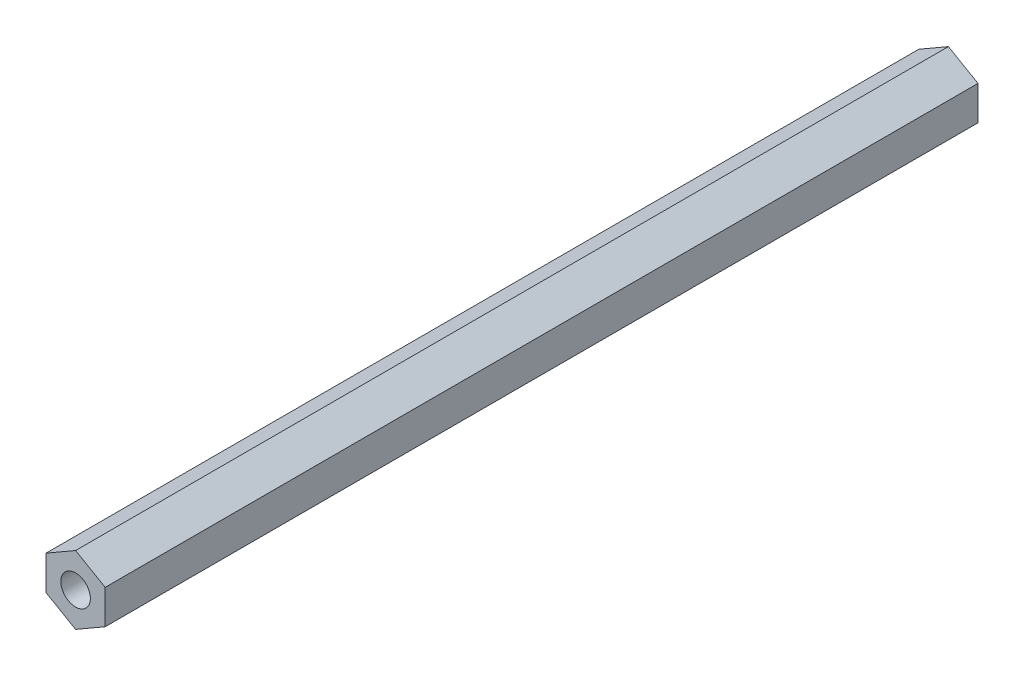
ISO-10303-21;
HEADER;
FILE_DESCRIPTION(('STEP AP214'),'2;1');
FILE_NAME('part.step','',(''),(''),'','','');
FILE_SCHEMA(('AUTOMOTIVE_DESIGN { 1 0 10303 214 1 1 1 1 }'));
ENDSEC;
DATA;
#1=APPLICATION_CONTEXT('core data for automotive mechanical design processes');
#2=APPLICATION_PROTOCOL_DEFINITION('international standard','automotive_design',2000,#1);
#3=PRODUCT_CONTEXT('',#1,'mechanical');
#4=PRODUCT('Part','Part','',(#3));
#5=PRODUCT_RELATED_PRODUCT_CATEGORY('part','',(#4));
#6=PRODUCT_DEFINITION_FORMATION('','',#4);
#7=PRODUCT_DEFINITION_CONTEXT('part definition',#1,'design');
#8=PRODUCT_DEFINITION('design','',#6,#7);
#9=PRODUCT_DEFINITION_SHAPE('','',#8);
#10=(LENGTH_UNIT() NAMED_UNIT(*) SI_UNIT(.MILLI.,.METRE.));
#11=(NAMED_UNIT(*) PLANE_ANGLE_UNIT() SI_UNIT($,.RADIAN.));
#12=(NAMED_UNIT(*) SI_UNIT($,.STERADIAN.) SOLID_ANGLE_UNIT());
#13=UNCERTAINTY_MEASURE_WITH_UNIT(LENGTH_MEASURE(1.E-05),#10,'distance_accuracy_value','');
#14=(GEOMETRIC_REPRESENTATION_CONTEXT(3) GLOBAL_UNCERTAINTY_ASSIGNED_CONTEXT((#13)) GLOBAL_UNIT_ASSIGNED_CONTEXT((#10,
#11,#12)) REPRESENTATION_CONTEXT('',''));
#15=CARTESIAN_POINT('',(0.,0.,0.));
#16=DIRECTION('',(0.,0.,1.));
#17=DIRECTION('',(1.,0.,0.));
#18=AXIS2_PLACEMENT_3D('',#15,#16,#17);
#19=CARTESIAN_POINT('',(0.,0.,187.325));
#20=DIRECTION('',(0.,0.,1.));
#21=DIRECTION('',(1.,0.,0.));
#22=AXIS2_PLACEMENT_3D('',#19,#20,#21);
#23=PLANE('',#22);
#24=DIRECTION('',(-0.866025403784441,0.499999999999995,0.));
#25=VECTOR('',#24,1.);
#26=CARTESIAN_POINT('',(6.34999999999995,3.66617420935419,187.325));
#27=LINE('',#26,#25);
#28=CARTESIAN_POINT('',(6.34999999999995,3.66617420935419,187.325));
#29=VERTEX_POINT('',#28);
#30=CARTESIAN_POINT('',(0.,7.33234841870824,187.325));
#31=VERTEX_POINT('',#30);
#32=EDGE_CURVE('E152',#29,#31,#27,.T.);
#33=ORIENTED_EDGE('',*,*,#32,.T.);
#34=DIRECTION('',(-0.866025403784438,-0.500000000000001,0.));
#35=VECTOR('',#34,1.);
#36=CARTESIAN_POINT('',(0.,7.33234841870824,187.325));
#37=LINE('',#36,#35);
#38=CARTESIAN_POINT('',(-6.35,3.6661742093541,187.325));
#39=VERTEX_POINT('',#38);
#40=EDGE_CURVE('E100',#31,#39,#37,.T.);
#41=ORIENTED_EDGE('',*,*,#40,.T.);
#42=DIRECTION('',(0.,-1.,0.));
#43=VECTOR('',#42,1.);
#44=CARTESIAN_POINT('',(-6.35,3.6661742093541,187.325));
#45=LINE('',#44,#43);
#46=CARTESIAN_POINT('',(-6.34999999999998,-3.66617420935415,187.325));
#47=VERTEX_POINT('',#46);
#48=EDGE_CURVE('E113',#39,#47,#45,.T.);
#49=ORIENTED_EDGE('',*,*,#48,.T.);
#50=DIRECTION('',(0.866025403784441,-0.499999999999995,0.));
#51=VECTOR('',#50,1.);
#52=CARTESIAN_POINT('',(-6.34999999999998,-3.66617420935415,187.325));
#53=LINE('',#52,#51);
#54=CARTESIAN_POINT('',(0.,-7.33234841870824,187.325));
#55=VERTEX_POINT('',#54);
#56=EDGE_CURVE('E107',#47,#55,#53,.T.);
#57=ORIENTED_EDGE('',*,*,#56,.T.);
#58=DIRECTION('',(0.866025403784435,0.500000000000007,0.));
#59=VECTOR('',#58,1.);
#60=CARTESIAN_POINT('',(0.,-7.33234841870824,187.325));
#61=LINE('',#60,#59);
#62=CARTESIAN_POINT('',(6.35000000000003,-3.66617420935406,187.325));
#63=VERTEX_POINT('',#62);
#64=EDGE_CURVE('E111',#55,#63,#61,.T.);
#65=ORIENTED_EDGE('',*,*,#64,.T.);
#66=DIRECTION('',(0.,1.,0.));
#67=VECTOR('',#66,1.);
#68=CARTESIAN_POINT('',(6.35000000000003,-3.66617420935406,187.325));
#69=LINE('',#68,#67);
#70=EDGE_CURVE('E63',#63,#29,#69,.T.);
#71=ORIENTED_EDGE('',*,*,#70,.T.);
#72=EDGE_LOOP('',(#33,#41,#49,#57,#65,#71));
#73=FACE_BOUND('',#72,.T.);
#74=CARTESIAN_POINT('',(0.,0.,187.325));
#75=DIRECTION('',(0.,0.,1.));
#76=DIRECTION('',(1.,0.,0.));
#77=AXIS2_PLACEMENT_3D('',#74,#75,#76);
#78=CIRCLE('',#77,3.175);
#79=CARTESIAN_POINT('',(-3.175,0.,187.325));
#80=VERTEX_POINT('',#79);
#81=EDGE_CURVE('E140',#80,#80,#78,.T.);
#82=ORIENTED_EDGE('',*,*,#81,.F.);
#83=EDGE_LOOP('',(#82));
#84=FACE_BOUND('',#83,.T.);
#85=ADVANCED_FACE('F45',(#73,#84),#23,.T.);
#86=CARTESIAN_POINT('',(0.,0.,0.));
#87=DIRECTION('',(0.,0.,1.));
#88=DIRECTION('',(1.,0.,0.));
#89=AXIS2_PLACEMENT_3D('',#86,#87,#88);
#90=PLANE('',#89);
#91=DIRECTION('',(-0.866025403784441,0.499999999999995,0.));
#92=VECTOR('',#91,1.);
#93=CARTESIAN_POINT('',(6.34999999999995,3.66617420935419,0.));
#94=LINE('',#93,#92);
#95=CARTESIAN_POINT('',(6.34999999999995,3.66617420935419,0.));
#96=VERTEX_POINT('',#95);
#97=CARTESIAN_POINT('',(0.,7.33234841870824,0.));
#98=VERTEX_POINT('',#97);
#99=EDGE_CURVE('E135',#96,#98,#94,.T.);
#100=ORIENTED_EDGE('',*,*,#99,.F.);
#101=DIRECTION('',(0.,1.,0.));
#102=VECTOR('',#101,1.);
#103=CARTESIAN_POINT('',(6.35000000000003,-3.66617420935406,0.));
#104=LINE('',#103,#102);
#105=CARTESIAN_POINT('',(6.35000000000003,-3.66617420935406,0.));
#106=VERTEX_POINT('',#105);
#107=EDGE_CURVE('E92',#106,#96,#104,.T.);
#108=ORIENTED_EDGE('',*,*,#107,.F.);
#109=DIRECTION('',(0.866025403784435,0.500000000000007,0.));
#110=VECTOR('',#109,1.);
#111=CARTESIAN_POINT('',(0.,-7.33234841870824,0.));
#112=LINE('',#111,#110);
#113=CARTESIAN_POINT('',(0.,-7.33234841870824,0.));
#114=VERTEX_POINT('',#113);
#115=EDGE_CURVE('E86',#114,#106,#112,.T.);
#116=ORIENTED_EDGE('',*,*,#115,.F.);
#117=DIRECTION('',(0.866025403784441,-0.499999999999995,0.));
#118=VECTOR('',#117,1.);
#119=CARTESIAN_POINT('',(-6.34999999999998,-3.66617420935415,0.));
#120=LINE('',#119,#118);
#121=CARTESIAN_POINT('',(-6.34999999999998,-3.66617420935415,0.));
#122=VERTEX_POINT('',#121);
#123=EDGE_CURVE('E122',#122,#114,#120,.T.);
#124=ORIENTED_EDGE('',*,*,#123,.F.);
#125=DIRECTION('',(0.,-1.,0.));
#126=VECTOR('',#125,1.);
#127=CARTESIAN_POINT('',(-6.35,3.6661742093541,0.));
#128=LINE('',#127,#126);
#129=CARTESIAN_POINT('',(-6.35,3.6661742093541,0.));
#130=VERTEX_POINT('',#129);
#131=EDGE_CURVE('E143',#130,#122,#128,.T.);
#132=ORIENTED_EDGE('',*,*,#131,.F.);
#133=DIRECTION('',(-0.866025403784438,-0.500000000000001,0.));
#134=VECTOR('',#133,1.);
#135=CARTESIAN_POINT('',(0.,7.33234841870824,0.));
#136=LINE('',#135,#134);
#137=EDGE_CURVE('E139',#98,#130,#136,.T.);
#138=ORIENTED_EDGE('',*,*,#137,.F.);
#139=EDGE_LOOP('',(#100,#108,#116,#124,#132,#138));
#140=FACE_BOUND('',#139,.T.);
#141=CARTESIAN_POINT('',(0.,0.,0.));
#142=DIRECTION('',(0.,0.,1.));
#143=DIRECTION('',(1.,0.,0.));
#144=AXIS2_PLACEMENT_3D('',#141,#142,#143);
#145=CIRCLE('',#144,3.175);
#146=CARTESIAN_POINT('',(-3.175,0.,0.));
#147=VERTEX_POINT('',#146);
#148=EDGE_CURVE('E249',#147,#147,#145,.T.);
#149=ORIENTED_EDGE('',*,*,#148,.T.);
#150=EDGE_LOOP('',(#149));
#151=FACE_BOUND('',#150,.T.);
#152=ADVANCED_FACE('F165',(#140,#151),#90,.F.);
#153=CARTESIAN_POINT('',(6.34999999999995,3.66617420935419,187.325));
#154=DIRECTION('',(-0.499999999999995,-0.866025403784441,0.));
#155=DIRECTION('',(0.866025403784442,-0.499999999999995,0.));
#156=AXIS2_PLACEMENT_3D('',#153,#154,#155);
#157=PLANE('',#156);
#158=ORIENTED_EDGE('',*,*,#99,.T.);
#159=DIRECTION('',(0.,0.,-1.));
#160=VECTOR('',#159,1.);
#161=CARTESIAN_POINT('',(0.,7.33234841870824,187.325));
#162=LINE('',#161,#160);
#163=EDGE_CURVE('E11',#31,#98,#162,.T.);
#164=ORIENTED_EDGE('',*,*,#163,.F.);
#165=ORIENTED_EDGE('',*,*,#32,.F.);
#166=DIRECTION('',(0.,0.,-1.));
#167=VECTOR('',#166,1.);
#168=CARTESIAN_POINT('',(6.34999999999995,3.66617420935419,187.325));
#169=LINE('',#168,#167);
#170=EDGE_CURVE('E131',#29,#96,#169,.T.);
#171=ORIENTED_EDGE('',*,*,#170,.T.);
#172=EDGE_LOOP('',(#158,#164,#165,#171));
#173=FACE_BOUND('',#172,.T.);
#174=ADVANCED_FACE('F47',(#173),#157,.F.);
#175=CARTESIAN_POINT('',(0.,7.33234841870824,187.325));
#176=DIRECTION('',(0.500000000000001,-0.866025403784438,0.));
#177=DIRECTION('',(0.866025403784438,0.500000000000001,0.));
#178=AXIS2_PLACEMENT_3D('',#175,#176,#177);
#179=PLANE('',#178);
#180=ORIENTED_EDGE('',*,*,#137,.T.);
#181=DIRECTION('',(0.,0.,-1.));
#182=VECTOR('',#181,1.);
#183=CARTESIAN_POINT('',(-6.35,3.6661742093541,187.325));
#184=LINE('',#183,#182);
#185=EDGE_CURVE('E55',#39,#130,#184,.T.);
#186=ORIENTED_EDGE('',*,*,#185,.F.);
#187=ORIENTED_EDGE('',*,*,#40,.F.);
#188=ORIENTED_EDGE('',*,*,#163,.T.);
#189=EDGE_LOOP('',(#180,#186,#187,#188));
#190=FACE_BOUND('',#189,.T.);
#191=ADVANCED_FACE('F190',(#190),#179,.F.);
#192=CARTESIAN_POINT('',(-6.35,3.6661742093541,187.325));
#193=DIRECTION('',(1.,0.,0.));
#194=DIRECTION('',(0.,1.,0.));
#195=AXIS2_PLACEMENT_3D('',#192,#193,#194);
#196=PLANE('',#195);
#197=ORIENTED_EDGE('',*,*,#131,.T.);
#198=DIRECTION('',(0.,0.,-1.));
#199=VECTOR('',#198,1.);
#200=CARTESIAN_POINT('',(-6.34999999999998,-3.66617420935415,187.325));
#201=LINE('',#200,#199);
#202=EDGE_CURVE('E124',#47,#122,#201,.T.);
#203=ORIENTED_EDGE('',*,*,#202,.F.);
#204=ORIENTED_EDGE('',*,*,#48,.F.);
#205=ORIENTED_EDGE('',*,*,#185,.T.);
#206=EDGE_LOOP('',(#197,#203,#204,#205));
#207=FACE_BOUND('',#206,.T.);
#208=ADVANCED_FACE('F162',(#207),#196,.F.);
#209=CARTESIAN_POINT('',(-6.34999999999998,-3.66617420935415,187.325));
#210=DIRECTION('',(0.499999999999995,0.866025403784441,0.));
#211=DIRECTION('',(-0.866025403784442,0.499999999999995,0.));
#212=AXIS2_PLACEMENT_3D('',#209,#210,#211);
#213=PLANE('',#212);
#214=ORIENTED_EDGE('',*,*,#123,.T.);
#215=DIRECTION('',(0.,0.,-1.));
#216=VECTOR('',#215,1.);
#217=CARTESIAN_POINT('',(0.,-7.33234841870824,187.325));
#218=LINE('',#217,#216);
#219=EDGE_CURVE('E119',#55,#114,#218,.T.);
#220=ORIENTED_EDGE('',*,*,#219,.F.);
#221=ORIENTED_EDGE('',*,*,#56,.F.);
#222=ORIENTED_EDGE('',*,*,#202,.T.);
#223=EDGE_LOOP('',(#214,#220,#221,#222));
#224=FACE_BOUND('',#223,.T.);
#225=ADVANCED_FACE('F120',(#224),#213,.F.);
#226=CARTESIAN_POINT('',(0.,-7.33234841870824,187.325));
#227=DIRECTION('',(-0.500000000000007,0.866025403784434,0.));
#228=DIRECTION('',(-0.866025403784435,-0.500000000000007,0.));
#229=AXIS2_PLACEMENT_3D('',#226,#227,#228);
#230=PLANE('',#229);
#231=ORIENTED_EDGE('',*,*,#115,.T.);
#232=DIRECTION('',(0.,0.,-1.));
#233=VECTOR('',#232,1.);
#234=CARTESIAN_POINT('',(6.35000000000003,-3.66617420935406,187.325));
#235=LINE('',#234,#233);
#236=EDGE_CURVE('E125',#63,#106,#235,.T.);
#237=ORIENTED_EDGE('',*,*,#236,.F.);
#238=ORIENTED_EDGE('',*,*,#64,.F.);
#239=ORIENTED_EDGE('',*,*,#219,.T.);
#240=EDGE_LOOP('',(#231,#237,#238,#239));
#241=FACE_BOUND('',#240,.T.);
#242=ADVANCED_FACE('F127',(#241),#230,.F.);
#243=CARTESIAN_POINT('',(6.35000000000003,-3.66617420935406,187.325));
#244=DIRECTION('',(-1.,0.,0.));
#245=DIRECTION('',(0.,-1.,0.));
#246=AXIS2_PLACEMENT_3D('',#243,#244,#245);
#247=PLANE('',#246);
#248=ORIENTED_EDGE('',*,*,#107,.T.);
#249=ORIENTED_EDGE('',*,*,#170,.F.);
#250=ORIENTED_EDGE('',*,*,#70,.F.);
#251=ORIENTED_EDGE('',*,*,#236,.T.);
#252=EDGE_LOOP('',(#248,#249,#250,#251));
#253=FACE_BOUND('',#252,.T.);
#254=ADVANCED_FACE('F170',(#253),#247,.F.);
#255=CARTESIAN_POINT('',(0.,0.,187.325));
#256=DIRECTION('',(0.,0.,-1.));
#257=DIRECTION('',(-1.,0.,0.));
#258=AXIS2_PLACEMENT_3D('',#255,#256,#257);
#259=CYLINDRICAL_SURFACE('',#258,3.175);
#260=CARTESIAN_POINT('',(-3.175,0.,187.325));
#261=CARTESIAN_POINT('',(-3.175,0.,185.373697916667));
#262=CARTESIAN_POINT('',(-3.175,0.,183.422395833333));
#263=CARTESIAN_POINT('',(-3.175,0.,179.519791666667));
#264=CARTESIAN_POINT('',(-3.175,0.,177.568489583333));
#265=CARTESIAN_POINT('',(-3.175,0.,173.665885416667));
#266=CARTESIAN_POINT('',(-3.175,0.,171.714583333333));
#267=CARTESIAN_POINT('',(-3.175,0.,167.811979166667));
#268=CARTESIAN_POINT('',(-3.175,0.,165.860677083333));
#269=CARTESIAN_POINT('',(-3.175,0.,161.958072916667));
#270=CARTESIAN_POINT('',(-3.175,0.,160.006770833333));
#271=CARTESIAN_POINT('',(-3.175,0.,156.104166666667));
#272=CARTESIAN_POINT('',(-3.175,0.,154.152864583333));
#273=CARTESIAN_POINT('',(-3.175,0.,150.250260416667));
#274=CARTESIAN_POINT('',(-3.175,0.,148.298958333333));
#275=CARTESIAN_POINT('',(-3.175,0.,144.396354166667));
#276=CARTESIAN_POINT('',(-3.175,0.,142.445052083333));
#277=CARTESIAN_POINT('',(-3.175,0.,138.542447916667));
#278=CARTESIAN_POINT('',(-3.175,0.,136.591145833333));
#279=CARTESIAN_POINT('',(-3.175,0.,132.688541666667));
#280=CARTESIAN_POINT('',(-3.175,0.,130.737239583333));
#281=CARTESIAN_POINT('',(-3.175,0.,126.834635416667));
#282=CARTESIAN_POINT('',(-3.175,0.,124.883333333333));
#283=CARTESIAN_POINT('',(-3.175,0.,120.980729166667));
#284=CARTESIAN_POINT('',(-3.175,0.,119.029427083333));
#285=CARTESIAN_POINT('',(-3.175,0.,115.126822916667));
#286=CARTESIAN_POINT('',(-3.175,0.,113.175520833333));
#287=CARTESIAN_POINT('',(-3.175,0.,109.272916666667));
#288=CARTESIAN_POINT('',(-3.175,0.,107.321614583333));
#289=CARTESIAN_POINT('',(-3.175,0.,103.419010416667));
#290=CARTESIAN_POINT('',(-3.175,0.,101.467708333333));
#291=CARTESIAN_POINT('',(-3.175,0.,97.5651041666667));
#292=CARTESIAN_POINT('',(-3.175,0.,95.6138020833333));
#293=CARTESIAN_POINT('',(-3.175,0.,91.7111979166667));
#294=CARTESIAN_POINT('',(-3.175,0.,89.7598958333333));
#295=CARTESIAN_POINT('',(-3.175,0.,85.8572916666667));
#296=CARTESIAN_POINT('',(-3.175,0.,83.9059895833333));
#297=CARTESIAN_POINT('',(-3.175,0.,80.0033854166667));
#298=CARTESIAN_POINT('',(-3.175,0.,78.0520833333333));
#299=CARTESIAN_POINT('',(-3.175,0.,74.1494791666667));
#300=CARTESIAN_POINT('',(-3.175,0.,72.1981770833333));
#301=CARTESIAN_POINT('',(-3.175,0.,68.2955729166667));
#302=CARTESIAN_POINT('',(-3.175,0.,66.3442708333333));
#303=CARTESIAN_POINT('',(-3.175,0.,62.4416666666667));
#304=CARTESIAN_POINT('',(-3.175,0.,60.4903645833333));
#305=CARTESIAN_POINT('',(-3.175,0.,56.5877604166667));
#306=CARTESIAN_POINT('',(-3.175,0.,54.6364583333333));
#307=CARTESIAN_POINT('',(-3.175,0.,50.7338541666667));
#308=CARTESIAN_POINT('',(-3.175,0.,48.7825520833333));
#309=CARTESIAN_POINT('',(-3.175,0.,44.8799479166667));
#310=CARTESIAN_POINT('',(-3.175,0.,42.9286458333333));
#311=CARTESIAN_POINT('',(-3.175,0.,39.0260416666667));
#312=CARTESIAN_POINT('',(-3.175,0.,37.0747395833333));
#313=CARTESIAN_POINT('',(-3.175,0.,33.1721354166667));
#314=CARTESIAN_POINT('',(-3.175,0.,31.2208333333333));
#315=CARTESIAN_POINT('',(-3.175,0.,27.3182291666667));
#316=CARTESIAN_POINT('',(-3.175,0.,25.3669270833333));
#317=CARTESIAN_POINT('',(-3.175,0.,21.4643229166667));
#318=CARTESIAN_POINT('',(-3.175,0.,19.5130208333333));
#319=CARTESIAN_POINT('',(-3.175,0.,15.6104166666667));
#320=CARTESIAN_POINT('',(-3.175,0.,13.6591145833333));
#321=CARTESIAN_POINT('',(-3.175,0.,9.75651041666667));
#322=CARTESIAN_POINT('',(-3.175,0.,7.80520833333334));
#323=CARTESIAN_POINT('',(-3.175,0.,3.90260416666667));
#324=CARTESIAN_POINT('',(-3.175,0.,1.95130208333334));
#325=CARTESIAN_POINT('',(-3.175,0.,0.));
#326=B_SPLINE_CURVE_WITH_KNOTS('',3,(#260,#261,#262,#263,#264,#265,#266,#267,#268,#269,#270,
#271,#272,#273,#274,#275,#276,#277,#278,#279,#280,#281,#282,#283,#284,#285,#286,#287,#288,#289,
#290,#291,#292,#293,#294,#295,#296,#297,#298,#299,#300,#301,#302,#303,#304,#305,#306,#307,#308,
#309,#310,#311,#312,#313,#314,#315,#316,#317,#318,#319,#320,#321,#322,#323,#324,#325),
.UNSPECIFIED.,.F.,.F.,(4,2,2,2,2,2,2,2,2,2,2,2,2,2,2,2,2,2,2,2,2,2,2,2,2,2,2,2,2,2,2,2,4),(0.,
5.85390624999999,11.7078125,17.56171875,23.415625,29.26953125,35.1234375,40.97734375,46.83125,
52.68515625,58.5390625,64.39296875,70.246875,76.10078125,81.9546875,87.80859375,93.6625,
99.51640625,105.3703125,111.22421875,117.078125,122.93203125,128.7859375,134.63984375,140.49375,
146.34765625,152.2015625,158.05546875,163.909375,169.76328125,175.6171875,181.47109375,187.325),.UNSPECIFIED.);
#327=EDGE_CURVE('BSEAM172',#80,#147,#326,.T.);
#328=ORIENTED_EDGE('',*,*,#81,.T.);
#329=ORIENTED_EDGE('',*,*,#148,.F.);
#330=ORIENTED_EDGE('',*,*,#327,.T.);
#331=ORIENTED_EDGE('',*,*,#327,.F.);
#332=EDGE_LOOP('',(#328,#330,#329,#331));
#333=FACE_BOUND('',#332,.T.);
#334=ADVANCED_FACE('F172',(#333),#259,.F.);
#335=CLOSED_SHELL('',(#85,#152,#174,#191,#208,#225,#242,#254,#334));
#336=MANIFOLD_SOLID_BREP('B2',#335);
#337=ADVANCED_BREP_SHAPE_REPRESENTATION('',(#18,#336),#14);
#338=SHAPE_DEFINITION_REPRESENTATION(#9,#337);
ENDSEC;
END-ISO-10303-21;
